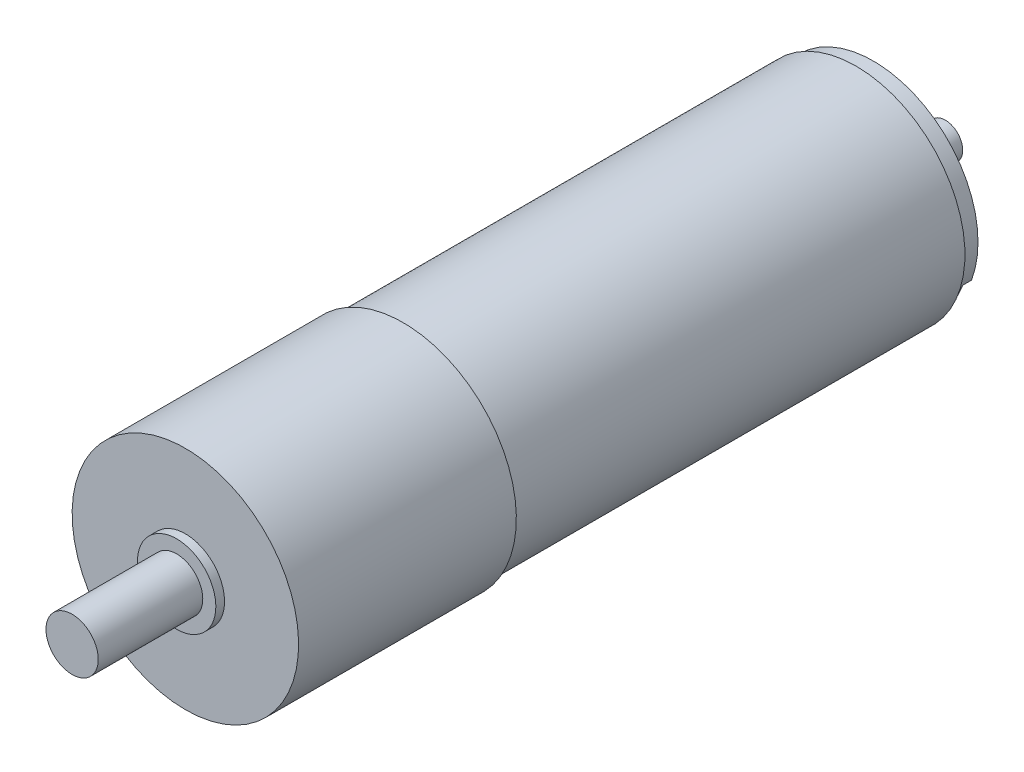
ISO-10303-21;
HEADER;
FILE_DESCRIPTION(('STEP AP214'),'2;1');
FILE_NAME('part.step','',(''),(''),'','','');
FILE_SCHEMA(('AUTOMOTIVE_DESIGN { 1 0 10303 214 1 1 1 1 }'));
ENDSEC;
DATA;
#1=APPLICATION_CONTEXT('core data for automotive mechanical design processes');
#2=APPLICATION_PROTOCOL_DEFINITION('international standard','automotive_design',2000,#1);
#3=PRODUCT_CONTEXT('',#1,'mechanical');
#4=PRODUCT('Part','Part','',(#3));
#5=PRODUCT_RELATED_PRODUCT_CATEGORY('part','',(#4));
#6=PRODUCT_DEFINITION_FORMATION('','',#4);
#7=PRODUCT_DEFINITION_CONTEXT('part definition',#1,'design');
#8=PRODUCT_DEFINITION('design','',#6,#7);
#9=PRODUCT_DEFINITION_SHAPE('','',#8);
#10=(LENGTH_UNIT() NAMED_UNIT(*) SI_UNIT(.MILLI.,.METRE.));
#11=(NAMED_UNIT(*) PLANE_ANGLE_UNIT() SI_UNIT($,.RADIAN.));
#12=(NAMED_UNIT(*) SI_UNIT($,.STERADIAN.) SOLID_ANGLE_UNIT());
#13=UNCERTAINTY_MEASURE_WITH_UNIT(LENGTH_MEASURE(1.E-05),#10,'distance_accuracy_value','');
#14=(GEOMETRIC_REPRESENTATION_CONTEXT(3) GLOBAL_UNCERTAINTY_ASSIGNED_CONTEXT((#13)) GLOBAL_UNIT_ASSIGNED_CONTEXT((#10,
#11,#12)) REPRESENTATION_CONTEXT('',''));
#15=CARTESIAN_POINT('',(0.,0.,0.));
#16=DIRECTION('',(0.,0.,1.));
#17=DIRECTION('',(1.,0.,0.));
#18=AXIS2_PLACEMENT_3D('',#15,#16,#17);
#19=CARTESIAN_POINT('',(0.,0.,76.));
#20=DIRECTION('',(0.,0.,-1.));
#21=DIRECTION('',(0.,1.,0.));
#22=AXIS2_PLACEMENT_3D('',#19,#20,#21);
#23=PLANE('',#22);
#24=CARTESIAN_POINT('',(0.,0.,76.));
#25=DIRECTION('',(0.,0.,1.));
#26=DIRECTION('',(0.,-1.,0.));
#27=AXIS2_PLACEMENT_3D('',#24,#25,#26);
#28=CIRCLE('',#27,6.00000000000001);
#29=CARTESIAN_POINT('',(0.,-6.00000000000002,76.));
#30=VERTEX_POINT('',#29);
#31=EDGE_CURVE('E157',#30,#30,#28,.T.);
#32=ORIENTED_EDGE('',*,*,#31,.T.);
#33=EDGE_LOOP('',(#32));
#34=FACE_BOUND('',#33,.T.);
#35=ADVANCED_FACE('F33',(#34),#23,.F.);
#36=CARTESIAN_POINT('',(0.,0.,76.));
#37=DIRECTION('',(0.,0.,1.));
#38=DIRECTION('',(0.,-1.,0.));
#39=AXIS2_PLACEMENT_3D('',#36,#37,#38);
#40=CYLINDRICAL_SURFACE('',#39,6.00000000000001);
#41=ORIENTED_EDGE('',*,*,#31,.F.);
#42=EDGE_LOOP('',(#41));
#43=FACE_BOUND('',#42,.T.);
#44=CARTESIAN_POINT('',(0.,0.,52.));
#45=DIRECTION('',(0.,0.,1.));
#46=DIRECTION('',(0.,-1.,0.));
#47=AXIS2_PLACEMENT_3D('',#44,#45,#46);
#48=CIRCLE('',#47,6.00000000000001);
#49=CARTESIAN_POINT('',(0.,-6.00000000000002,52.));
#50=VERTEX_POINT('',#49);
#51=EDGE_CURVE('E154',#50,#50,#48,.T.);
#52=ORIENTED_EDGE('',*,*,#51,.T.);
#53=EDGE_LOOP('',(#52));
#54=FACE_BOUND('',#53,.T.);
#55=ADVANCED_FACE('F183',(#43,#54),#40,.T.);
#56=CARTESIAN_POINT('',(0.,6.,52.));
#57=DIRECTION('',(0.,0.,-1.));
#58=DIRECTION('',(0.,1.,0.));
#59=AXIS2_PLACEMENT_3D('',#56,#57,#58);
#60=PLANE('',#59);
#61=ORIENTED_EDGE('',*,*,#51,.F.);
#62=EDGE_LOOP('',(#61));
#63=FACE_BOUND('',#62,.T.);
#64=CARTESIAN_POINT('',(0.,0.,52.));
#65=DIRECTION('',(0.,0.,1.));
#66=DIRECTION('',(0.,-1.,0.));
#67=AXIS2_PLACEMENT_3D('',#64,#65,#66);
#68=CIRCLE('',#67,9.00000000000001);
#69=CARTESIAN_POINT('',(0.,-9.00000000000002,52.));
#70=VERTEX_POINT('',#69);
#71=EDGE_CURVE('E151',#70,#70,#68,.T.);
#72=ORIENTED_EDGE('',*,*,#71,.T.);
#73=EDGE_LOOP('',(#72));
#74=FACE_BOUND('',#73,.T.);
#75=ADVANCED_FACE('F188',(#63,#74),#60,.F.);
#76=CARTESIAN_POINT('',(0.,0.,76.));
#77=DIRECTION('',(0.,0.,1.));
#78=DIRECTION('',(0.,-1.,0.));
#79=AXIS2_PLACEMENT_3D('',#76,#77,#78);
#80=CYLINDRICAL_SURFACE('',#79,9.00000000000001);
#81=ORIENTED_EDGE('',*,*,#71,.F.);
#82=EDGE_LOOP('',(#81));
#83=FACE_BOUND('',#82,.T.);
#84=CARTESIAN_POINT('',(0.,0.,50.));
#85=DIRECTION('',(0.,0.,1.));
#86=DIRECTION('',(0.,-1.,0.));
#87=AXIS2_PLACEMENT_3D('',#84,#85,#86);
#88=CIRCLE('',#87,9.00000000000001);
#89=CARTESIAN_POINT('',(0.,-9.00000000000002,50.));
#90=VERTEX_POINT('',#89);
#91=EDGE_CURVE('E148',#90,#90,#88,.T.);
#92=ORIENTED_EDGE('',*,*,#91,.T.);
#93=EDGE_LOOP('',(#92));
#94=FACE_BOUND('',#93,.T.);
#95=ADVANCED_FACE('F196',(#83,#94),#80,.T.);
#96=CARTESIAN_POINT('',(0.,9.,50.));
#97=DIRECTION('',(0.,0.,-1.));
#98=DIRECTION('',(0.,1.,0.));
#99=AXIS2_PLACEMENT_3D('',#96,#97,#98);
#100=PLANE('',#99);
#101=ORIENTED_EDGE('',*,*,#91,.F.);
#102=EDGE_LOOP('',(#101));
#103=FACE_BOUND('',#102,.T.);
#104=CARTESIAN_POINT('',(0.,0.,50.));
#105=DIRECTION('',(0.,0.,1.));
#106=DIRECTION('',(0.,-1.,0.));
#107=AXIS2_PLACEMENT_3D('',#104,#105,#106);
#108=CIRCLE('',#107,26.);
#109=CARTESIAN_POINT('',(0.,-26.,50.));
#110=VERTEX_POINT('',#109);
#111=EDGE_CURVE('E145',#110,#110,#108,.T.);
#112=ORIENTED_EDGE('',*,*,#111,.T.);
#113=EDGE_LOOP('',(#112));
#114=FACE_BOUND('',#113,.T.);
#115=ADVANCED_FACE('F202',(#103,#114),#100,.F.);
#116=CARTESIAN_POINT('',(0.,0.,76.));
#117=DIRECTION('',(0.,0.,1.));
#118=DIRECTION('',(0.,-1.,0.));
#119=AXIS2_PLACEMENT_3D('',#116,#117,#118);
#120=CYLINDRICAL_SURFACE('',#119,26.);
#121=ORIENTED_EDGE('',*,*,#111,.F.);
#122=EDGE_LOOP('',(#121));
#123=FACE_BOUND('',#122,.T.);
#124=CARTESIAN_POINT('',(0.,0.,0.));
#125=DIRECTION('',(0.,0.,1.));
#126=DIRECTION('',(0.,-1.,0.));
#127=AXIS2_PLACEMENT_3D('',#124,#125,#126);
#128=CIRCLE('',#127,26.);
#129=CARTESIAN_POINT('',(0.,-26.,0.));
#130=VERTEX_POINT('',#129);
#131=EDGE_CURVE('E142',#130,#130,#128,.T.);
#132=ORIENTED_EDGE('',*,*,#131,.T.);
#133=EDGE_LOOP('',(#132));
#134=FACE_BOUND('',#133,.T.);
#135=ADVANCED_FACE('F208',(#123,#134),#120,.T.);
#136=CARTESIAN_POINT('',(0.,26.,0.));
#137=DIRECTION('',(0.,0.,1.));
#138=DIRECTION('',(0.,-1.,0.));
#139=AXIS2_PLACEMENT_3D('',#136,#137,#138);
#140=PLANE('',#139);
#141=ORIENTED_EDGE('',*,*,#131,.F.);
#142=EDGE_LOOP('',(#141));
#143=FACE_BOUND('',#142,.T.);
#144=CARTESIAN_POINT('',(0.,0.,0.));
#145=DIRECTION('',(0.,0.,1.));
#146=DIRECTION('',(0.,-1.,0.));
#147=AXIS2_PLACEMENT_3D('',#144,#145,#146);
#148=CIRCLE('',#147,25.);
#149=CARTESIAN_POINT('',(0.,-25.,0.));
#150=VERTEX_POINT('',#149);
#151=EDGE_CURVE('E139',#150,#150,#148,.T.);
#152=ORIENTED_EDGE('',*,*,#151,.T.);
#153=EDGE_LOOP('',(#152));
#154=FACE_BOUND('',#153,.T.);
#155=ADVANCED_FACE('F214',(#143,#154),#140,.F.);
#156=CARTESIAN_POINT('',(0.,0.,76.));
#157=DIRECTION('',(0.,0.,1.));
#158=DIRECTION('',(0.,-1.,0.));
#159=AXIS2_PLACEMENT_3D('',#156,#157,#158);
#160=CYLINDRICAL_SURFACE('',#159,25.);
#161=ORIENTED_EDGE('',*,*,#151,.F.);
#162=EDGE_LOOP('',(#161));
#163=FACE_BOUND('',#162,.T.);
#164=CARTESIAN_POINT('',(0.,0.,-104.));
#165=DIRECTION('',(0.,0.,1.));
#166=DIRECTION('',(0.,-1.,0.));
#167=AXIS2_PLACEMENT_3D('',#164,#165,#166);
#168=CIRCLE('',#167,25.);
#169=CARTESIAN_POINT('',(0.,-25.,-104.));
#170=VERTEX_POINT('',#169);
#171=EDGE_CURVE('E136',#170,#170,#168,.T.);
#172=ORIENTED_EDGE('',*,*,#171,.T.);
#173=EDGE_LOOP('',(#172));
#174=FACE_BOUND('',#173,.T.);
#175=ADVANCED_FACE('F178',(#163,#174),#160,.T.);
#176=CARTESIAN_POINT('',(0.,25.,-104.));
#177=DIRECTION('',(0.,0.,1.));
#178=DIRECTION('',(0.,-1.,0.));
#179=AXIS2_PLACEMENT_3D('',#176,#177,#178);
#180=PLANE('',#179);
#181=ORIENTED_EDGE('',*,*,#171,.F.);
#182=EDGE_LOOP('',(#181));
#183=FACE_BOUND('',#182,.T.);
#184=CARTESIAN_POINT('',(0.,0.,-104.));
#185=DIRECTION('',(0.,0.,1.));
#186=DIRECTION('',(0.,-1.,0.));
#187=AXIS2_PLACEMENT_3D('',#184,#185,#186);
#188=CIRCLE('',#187,24.);
#189=CARTESIAN_POINT('',(0.,-24.,-104.));
#190=VERTEX_POINT('',#189);
#191=EDGE_CURVE('E133',#190,#190,#188,.T.);
#192=ORIENTED_EDGE('',*,*,#191,.T.);
#193=EDGE_LOOP('',(#192));
#194=FACE_BOUND('',#193,.T.);
#195=ADVANCED_FACE('F167',(#183,#194),#180,.F.);
#196=CARTESIAN_POINT('',(0.,0.,76.));
#197=DIRECTION('',(0.,0.,1.));
#198=DIRECTION('',(0.,-1.,0.));
#199=AXIS2_PLACEMENT_3D('',#196,#197,#198);
#200=CYLINDRICAL_SURFACE('',#199,24.);
#201=ORIENTED_EDGE('',*,*,#191,.F.);
#202=EDGE_LOOP('',(#201));
#203=FACE_BOUND('',#202,.T.);
#204=CARTESIAN_POINT('',(0.,0.,-106.));
#205=DIRECTION('',(0.,0.,1.));
#206=DIRECTION('',(1.,0.,0.));
#207=AXIS2_PLACEMENT_3D('',#204,#205,#206);
#208=CIRCLE('',#207,24.);
#209=CARTESIAN_POINT('',(8.37808259667982,-22.4901696748426,-106.));
#210=VERTEX_POINT('',#209);
#211=CARTESIAN_POINT('',(22.5064418611777,-8.33427109886812,-106.));
#212=VERTEX_POINT('',#211);
#213=EDGE_CURVE('E11',#210,#212,#208,.T.);
#214=ORIENTED_EDGE('',*,*,#213,.T.);
#215=DIRECTION('',(0.,0.,1.));
#216=VECTOR('',#215,1.);
#217=CARTESIAN_POINT('',(22.5064418611777,-8.33427109886813,76.));
#218=LINE('',#217,#216);
#219=CARTESIAN_POINT('',(22.5064418611777,-8.33427109886813,-108.));
#220=VERTEX_POINT('',#219);
#221=EDGE_CURVE('E55',#212,#220,#218,.F.);
#222=ORIENTED_EDGE('',*,*,#221,.T.);
#223=CARTESIAN_POINT('',(0.,0.,-108.));
#224=DIRECTION('',(0.,0.,1.));
#225=DIRECTION('',(0.,-1.,0.));
#226=AXIS2_PLACEMENT_3D('',#223,#224,#225);
#227=CIRCLE('',#226,24.);
#228=CARTESIAN_POINT('',(8.37808259667982,-22.4901696748426,-108.));
#229=VERTEX_POINT('',#228);
#230=EDGE_CURVE('E130',#220,#229,#227,.T.);
#231=ORIENTED_EDGE('',*,*,#230,.T.);
#232=DIRECTION('',(0.,0.,1.));
#233=VECTOR('',#232,1.);
#234=CARTESIAN_POINT('',(8.37808259667982,-22.4901696748426,76.));
#235=LINE('',#234,#233);
#236=EDGE_CURVE('E47',#229,#210,#235,.T.);
#237=ORIENTED_EDGE('',*,*,#236,.T.);
#238=EDGE_LOOP('',(#214,#222,#231,#237));
#239=FACE_BOUND('',#238,.T.);
#240=ADVANCED_FACE('F165',(#203,#239),#200,.T.);
#241=CARTESIAN_POINT('',(0.,24.,-108.));
#242=DIRECTION('',(0.,0.,1.));
#243=DIRECTION('',(0.,-1.,0.));
#244=AXIS2_PLACEMENT_3D('',#241,#242,#243);
#245=PLANE('',#244);
#246=CARTESIAN_POINT('',(6.76785942282004,19.0325005932732,-108.));
#247=DIRECTION('',(0.,0.,1.));
#248=DIRECTION('',(1.,0.,0.));
#249=AXIS2_PLACEMENT_3D('',#246,#247,#248);
#250=CIRCLE('',#249,2.80000000000006);
#251=CARTESIAN_POINT('',(3.96785942281998,19.0325005932732,-108.));
#252=VERTEX_POINT('',#251);
#253=EDGE_CURVE('E105',#252,#252,#250,.T.);
#254=ORIENTED_EDGE('',*,*,#253,.T.);
#255=EDGE_LOOP('',(#254));
#256=FACE_BOUND('',#255,.T.);
#257=CARTESIAN_POINT('',(-19.9059854313234,3.43391089108909,-108.));
#258=DIRECTION('',(0.,0.,1.));
#259=DIRECTION('',(1.,0.,0.));
#260=AXIS2_PLACEMENT_3D('',#257,#258,#259);
#261=CIRCLE('',#260,2.80000000000001);
#262=CARTESIAN_POINT('',(-22.7059854313234,3.43391089108909,-108.));
#263=VERTEX_POINT('',#262);
#264=EDGE_CURVE('E111',#263,#263,#261,.T.);
#265=ORIENTED_EDGE('',*,*,#264,.T.);
#266=EDGE_LOOP('',(#265));
#267=FACE_BOUND('',#266,.T.);
#268=CARTESIAN_POINT('',(0.,-20.2,-108.));
#269=DIRECTION('',(0.,0.,1.));
#270=DIRECTION('',(1.,0.,0.));
#271=AXIS2_PLACEMENT_3D('',#268,#269,#270);
#272=CIRCLE('',#271,2.8);
#273=CARTESIAN_POINT('',(-2.8,-20.2,-108.));
#274=VERTEX_POINT('',#273);
#275=EDGE_CURVE('E100',#274,#274,#272,.T.);
#276=ORIENTED_EDGE('',*,*,#275,.T.);
#277=EDGE_LOOP('',(#276));
#278=FACE_BOUND('',#277,.T.);
#279=ORIENTED_EDGE('',*,*,#230,.F.);
#280=DIRECTION('',(0.707794928798725,-0.706417963224895,0.));
#281=VECTOR('',#280,1.);
#282=CARTESIAN_POINT('',(22.5064418611777,-8.33427109886812,-108.));
#283=LINE('',#282,#281);
#284=CARTESIAN_POINT('',(16.9733086354311,-2.81190219716126,-108.));
#285=VERTEX_POINT('',#284);
#286=EDGE_CURVE('E95',#285,#220,#283,.T.);
#287=ORIENTED_EDGE('',*,*,#286,.F.);
#288=DIRECTION('',(0.706417963224894,0.707794928798725,0.));
#289=VECTOR('',#288,1.);
#290=CARTESIAN_POINT('',(16.9733086354311,-2.81190219716126,-108.));
#291=LINE('',#290,#289);
#292=CARTESIAN_POINT('',(2.84494937093321,-16.9678007731358,-108.));
#293=VERTEX_POINT('',#292);
#294=EDGE_CURVE('E93',#293,#285,#291,.T.);
#295=ORIENTED_EDGE('',*,*,#294,.F.);
#296=DIRECTION('',(0.707794928798726,-0.706417963224893,0.));
#297=VECTOR('',#296,1.);
#298=CARTESIAN_POINT('',(-19.0641568798386,4.8986828424161,-108.));
#299=LINE('',#298,#297);
#300=EDGE_CURVE('E40',#293,#229,#299,.T.);
#301=ORIENTED_EDGE('',*,*,#300,.T.);
#302=EDGE_LOOP('',(#279,#287,#295,#301));
#303=FACE_BOUND('',#302,.T.);
#304=CARTESIAN_POINT('',(0.,0.,-108.));
#305=DIRECTION('',(0.,0.,1.));
#306=DIRECTION('',(0.,-1.,0.));
#307=AXIS2_PLACEMENT_3D('',#304,#305,#306);
#308=CIRCLE('',#307,8.);
#309=CARTESIAN_POINT('',(0.,-8.,-108.));
#310=VERTEX_POINT('',#309);
#311=EDGE_CURVE('E127',#310,#310,#308,.T.);
#312=ORIENTED_EDGE('',*,*,#311,.T.);
#313=EDGE_LOOP('',(#312));
#314=FACE_BOUND('',#313,.T.);
#315=ADVANCED_FACE('F161',(#256,#267,#278,#303,#314),#245,.F.);
#316=CARTESIAN_POINT('',(0.,0.,76.));
#317=DIRECTION('',(0.,0.,1.));
#318=DIRECTION('',(0.,-1.,0.));
#319=AXIS2_PLACEMENT_3D('',#316,#317,#318);
#320=CYLINDRICAL_SURFACE('',#319,8.);
#321=ORIENTED_EDGE('',*,*,#311,.F.);
#322=EDGE_LOOP('',(#321));
#323=FACE_BOUND('',#322,.T.);
#324=CARTESIAN_POINT('',(0.,0.,-109.));
#325=DIRECTION('',(0.,0.,1.));
#326=DIRECTION('',(0.,-1.,0.));
#327=AXIS2_PLACEMENT_3D('',#324,#325,#326);
#328=CIRCLE('',#327,8.);
#329=CARTESIAN_POINT('',(0.,-8.,-109.));
#330=VERTEX_POINT('',#329);
#331=EDGE_CURVE('E124',#330,#330,#328,.T.);
#332=ORIENTED_EDGE('',*,*,#331,.T.);
#333=EDGE_LOOP('',(#332));
#334=FACE_BOUND('',#333,.T.);
#335=ADVANCED_FACE('F174',(#323,#334),#320,.T.);
#336=CARTESIAN_POINT('',(0.,8.,-109.));
#337=DIRECTION('',(0.,0.,1.));
#338=DIRECTION('',(0.,-1.,0.));
#339=AXIS2_PLACEMENT_3D('',#336,#337,#338);
#340=PLANE('',#339);
#341=ORIENTED_EDGE('',*,*,#331,.F.);
#342=EDGE_LOOP('',(#341));
#343=FACE_BOUND('',#342,.T.);
#344=CARTESIAN_POINT('',(0.,0.,-109.));
#345=DIRECTION('',(0.,0.,1.));
#346=DIRECTION('',(0.,-1.,0.));
#347=AXIS2_PLACEMENT_3D('',#344,#345,#346);
#348=CIRCLE('',#347,4.);
#349=CARTESIAN_POINT('',(0.,-4.,-109.));
#350=VERTEX_POINT('',#349);
#351=EDGE_CURVE('E121',#350,#350,#348,.T.);
#352=ORIENTED_EDGE('',*,*,#351,.T.);
#353=EDGE_LOOP('',(#352));
#354=FACE_BOUND('',#353,.T.);
#355=ADVANCED_FACE('F254',(#343,#354),#340,.F.);
#356=CARTESIAN_POINT('',(0.,0.,76.));
#357=DIRECTION('',(0.,0.,1.));
#358=DIRECTION('',(0.,-1.,0.));
#359=AXIS2_PLACEMENT_3D('',#356,#357,#358);
#360=CYLINDRICAL_SURFACE('',#359,4.);
#361=ORIENTED_EDGE('',*,*,#351,.F.);
#362=EDGE_LOOP('',(#361));
#363=FACE_BOUND('',#362,.T.);
#364=CARTESIAN_POINT('',(0.,0.,-124.5));
#365=DIRECTION('',(0.,0.,1.));
#366=DIRECTION('',(0.,-1.,0.));
#367=AXIS2_PLACEMENT_3D('',#364,#365,#366);
#368=CIRCLE('',#367,4.);
#369=CARTESIAN_POINT('',(0.,-4.,-124.5));
#370=VERTEX_POINT('',#369);
#371=EDGE_CURVE('E104',#370,#370,#368,.T.);
#372=ORIENTED_EDGE('',*,*,#371,.T.);
#373=EDGE_LOOP('',(#372));
#374=FACE_BOUND('',#373,.T.);
#375=ADVANCED_FACE('F261',(#363,#374),#360,.T.);
#376=CARTESIAN_POINT('',(0.,4.,-124.5));
#377=DIRECTION('',(0.,0.,1.));
#378=DIRECTION('',(0.,-1.,0.));
#379=AXIS2_PLACEMENT_3D('',#376,#377,#378);
#380=PLANE('',#379);
#381=ORIENTED_EDGE('',*,*,#371,.F.);
#382=EDGE_LOOP('',(#381));
#383=FACE_BOUND('',#382,.T.);
#384=ADVANCED_FACE('F269',(#383),#380,.F.);
#385=CARTESIAN_POINT('',(0.,-20.2,-104.75));
#386=DIRECTION('',(0.,0.,-1.));
#387=DIRECTION('',(-1.,0.,0.));
#388=AXIS2_PLACEMENT_3D('',#385,#386,#387);
#389=CYLINDRICAL_SURFACE('',#388,2.8);
#390=CARTESIAN_POINT('',(0.,-20.2,-104.75));
#391=DIRECTION('',(0.,0.,1.));
#392=DIRECTION('',(1.,0.,0.));
#393=AXIS2_PLACEMENT_3D('',#390,#391,#392);
#394=CIRCLE('',#393,2.8);
#395=CARTESIAN_POINT('',(-2.8,-20.2,-104.75));
#396=VERTEX_POINT('',#395);
#397=EDGE_CURVE('E114',#396,#396,#394,.T.);
#398=CARTESIAN_POINT('',(-2.8,-20.2,-104.75));
#399=CARTESIAN_POINT('',(-2.8,-20.2,-104.783854166667));
#400=CARTESIAN_POINT('',(-2.8,-20.2,-104.817708333333));
#401=CARTESIAN_POINT('',(-2.8,-20.2,-104.885416666667));
#402=CARTESIAN_POINT('',(-2.8,-20.2,-104.919270833333));
#403=CARTESIAN_POINT('',(-2.8,-20.2,-104.986979166667));
#404=CARTESIAN_POINT('',(-2.8,-20.2,-105.020833333333));
#405=CARTESIAN_POINT('',(-2.8,-20.2,-105.088541666667));
#406=CARTESIAN_POINT('',(-2.8,-20.2,-105.122395833333));
#407=CARTESIAN_POINT('',(-2.8,-20.2,-105.190104166667));
#408=CARTESIAN_POINT('',(-2.8,-20.2,-105.223958333333));
#409=CARTESIAN_POINT('',(-2.8,-20.2,-105.291666666667));
#410=CARTESIAN_POINT('',(-2.8,-20.2,-105.325520833333));
#411=CARTESIAN_POINT('',(-2.8,-20.2,-105.393229166667));
#412=CARTESIAN_POINT('',(-2.8,-20.2,-105.427083333333));
#413=CARTESIAN_POINT('',(-2.8,-20.2,-105.494791666667));
#414=CARTESIAN_POINT('',(-2.8,-20.2,-105.528645833333));
#415=CARTESIAN_POINT('',(-2.8,-20.2,-105.596354166667));
#416=CARTESIAN_POINT('',(-2.8,-20.2,-105.630208333333));
#417=CARTESIAN_POINT('',(-2.8,-20.2,-105.697916666667));
#418=CARTESIAN_POINT('',(-2.8,-20.2,-105.731770833333));
#419=CARTESIAN_POINT('',(-2.8,-20.2,-105.799479166667));
#420=CARTESIAN_POINT('',(-2.8,-20.2,-105.833333333333));
#421=CARTESIAN_POINT('',(-2.8,-20.2,-105.901041666667));
#422=CARTESIAN_POINT('',(-2.8,-20.2,-105.934895833333));
#423=CARTESIAN_POINT('',(-2.8,-20.2,-106.002604166667));
#424=CARTESIAN_POINT('',(-2.8,-20.2,-106.036458333333));
#425=CARTESIAN_POINT('',(-2.8,-20.2,-106.104166666667));
#426=CARTESIAN_POINT('',(-2.8,-20.2,-106.138020833333));
#427=CARTESIAN_POINT('',(-2.8,-20.2,-106.205729166667));
#428=CARTESIAN_POINT('',(-2.8,-20.2,-106.239583333333));
#429=CARTESIAN_POINT('',(-2.8,-20.2,-106.307291666667));
#430=CARTESIAN_POINT('',(-2.8,-20.2,-106.341145833333));
#431=CARTESIAN_POINT('',(-2.8,-20.2,-106.408854166667));
#432=CARTESIAN_POINT('',(-2.8,-20.2,-106.442708333333));
#433=CARTESIAN_POINT('',(-2.8,-20.2,-106.510416666667));
#434=CARTESIAN_POINT('',(-2.8,-20.2,-106.544270833333));
#435=CARTESIAN_POINT('',(-2.8,-20.2,-106.611979166667));
#436=CARTESIAN_POINT('',(-2.8,-20.2,-106.645833333333));
#437=CARTESIAN_POINT('',(-2.8,-20.2,-106.713541666667));
#438=CARTESIAN_POINT('',(-2.8,-20.2,-106.747395833333));
#439=CARTESIAN_POINT('',(-2.8,-20.2,-106.815104166667));
#440=CARTESIAN_POINT('',(-2.8,-20.2,-106.848958333333));
#441=CARTESIAN_POINT('',(-2.8,-20.2,-106.916666666667));
#442=CARTESIAN_POINT('',(-2.8,-20.2,-106.950520833333));
#443=CARTESIAN_POINT('',(-2.8,-20.2,-107.018229166667));
#444=CARTESIAN_POINT('',(-2.8,-20.2,-107.052083333333));
#445=CARTESIAN_POINT('',(-2.8,-20.2,-107.119791666667));
#446=CARTESIAN_POINT('',(-2.8,-20.2,-107.153645833333));
#447=CARTESIAN_POINT('',(-2.8,-20.2,-107.221354166667));
#448=CARTESIAN_POINT('',(-2.8,-20.2,-107.255208333333));
#449=CARTESIAN_POINT('',(-2.8,-20.2,-107.322916666667));
#450=CARTESIAN_POINT('',(-2.8,-20.2,-107.356770833333));
#451=CARTESIAN_POINT('',(-2.8,-20.2,-107.424479166667));
#452=CARTESIAN_POINT('',(-2.8,-20.2,-107.458333333333));
#453=CARTESIAN_POINT('',(-2.8,-20.2,-107.526041666667));
#454=CARTESIAN_POINT('',(-2.8,-20.2,-107.559895833333));
#455=CARTESIAN_POINT('',(-2.8,-20.2,-107.627604166667));
#456=CARTESIAN_POINT('',(-2.8,-20.2,-107.661458333333));
#457=CARTESIAN_POINT('',(-2.8,-20.2,-107.729166666667));
#458=CARTESIAN_POINT('',(-2.8,-20.2,-107.763020833333));
#459=CARTESIAN_POINT('',(-2.8,-20.2,-107.830729166667));
#460=CARTESIAN_POINT('',(-2.8,-20.2,-107.864583333333));
#461=CARTESIAN_POINT('',(-2.8,-20.2,-107.932291666667));
#462=CARTESIAN_POINT('',(-2.8,-20.2,-107.966145833333));
#463=CARTESIAN_POINT('',(-2.8,-20.2,-108.));
#464=B_SPLINE_CURVE_WITH_KNOTS('',3,(#398,#399,#400,#401,#402,#403,#404,#405,#406,#407,#408,
#409,#410,#411,#412,#413,#414,#415,#416,#417,#418,#419,#420,#421,#422,#423,#424,#425,#426,#427,
#428,#429,#430,#431,#432,#433,#434,#435,#436,#437,#438,#439,#440,#441,#442,#443,#444,#445,#446,
#447,#448,#449,#450,#451,#452,#453,#454,#455,#456,#457,#458,#459,#460,#461,#462,#463),
.UNSPECIFIED.,.F.,.F.,(4,2,2,2,2,2,2,2,2,2,2,2,2,2,2,2,2,2,2,2,2,2,2,2,2,2,2,2,2,2,2,2,4),(0.,
0.101562500000013,0.203125000000012,0.304687500000012,0.406250000000011,0.50781250000001,
0.609375000000009,0.710937500000008,0.812500000000008,0.914062500000007,1.01562500000001,
1.11718750000001,1.21875,1.3203125,1.421875,1.5234375,1.62500000000002,1.72656250000001,
1.82812500000001,1.92968750000001,2.03125000000001,2.13281250000001,2.23437500000001,
2.33593750000001,2.43750000000001,2.53906250000001,2.64062500000001,2.74218750000001,
2.84375000000001,2.94531250000001,3.046875,3.1484375,3.25000000000002),.UNSPECIFIED.);
#465=EDGE_CURVE('BSEAM277',#396,#274,#464,.T.);
#466=ORIENTED_EDGE('',*,*,#397,.T.);
#467=ORIENTED_EDGE('',*,*,#275,.F.);
#468=ORIENTED_EDGE('',*,*,#465,.T.);
#469=ORIENTED_EDGE('',*,*,#465,.F.);
#470=EDGE_LOOP('',(#466,#468,#467,#469));
#471=FACE_BOUND('',#470,.T.);
#472=ADVANCED_FACE('F277',(#471),#389,.F.);
#473=CARTESIAN_POINT('',(0.,-20.2,-104.75));
#474=DIRECTION('',(0.,0.,1.));
#475=DIRECTION('',(1.,0.,0.));
#476=AXIS2_PLACEMENT_3D('',#473,#474,#475);
#477=PLANE('',#476);
#478=ORIENTED_EDGE('',*,*,#397,.F.);
#479=EDGE_LOOP('',(#478));
#480=FACE_BOUND('',#479,.T.);
#481=ADVANCED_FACE('F285',(#480),#477,.F.);
#482=CARTESIAN_POINT('',(-19.9059854313234,3.43391089108909,-104.75));
#483=DIRECTION('',(0.,0.,-1.));
#484=DIRECTION('',(-1.,0.,0.));
#485=AXIS2_PLACEMENT_3D('',#482,#483,#484);
#486=CYLINDRICAL_SURFACE('',#485,2.80000000000001);
#487=CARTESIAN_POINT('',(-19.9059854313234,3.43391089108909,-104.75));
#488=DIRECTION('',(0.,0.,1.));
#489=DIRECTION('',(1.,0.,0.));
#490=AXIS2_PLACEMENT_3D('',#487,#488,#489);
#491=CIRCLE('',#490,2.80000000000001);
#492=CARTESIAN_POINT('',(-22.7059854313234,3.43391089108909,-104.75));
#493=VERTEX_POINT('',#492);
#494=EDGE_CURVE('E108',#493,#493,#491,.T.);
#495=CARTESIAN_POINT('',(-22.7059854313234,3.43391089108909,-104.75));
#496=CARTESIAN_POINT('',(-22.7059854313234,3.43391089108909,-104.783854166667));
#497=CARTESIAN_POINT('',(-22.7059854313234,3.43391089108909,-104.817708333333));
#498=CARTESIAN_POINT('',(-22.7059854313234,3.43391089108909,-104.885416666667));
#499=CARTESIAN_POINT('',(-22.7059854313234,3.43391089108909,-104.919270833333));
#500=CARTESIAN_POINT('',(-22.7059854313234,3.43391089108909,-104.986979166667));
#501=CARTESIAN_POINT('',(-22.7059854313234,3.43391089108909,-105.020833333333));
#502=CARTESIAN_POINT('',(-22.7059854313234,3.43391089108909,-105.088541666667));
#503=CARTESIAN_POINT('',(-22.7059854313234,3.43391089108909,-105.122395833333));
#504=CARTESIAN_POINT('',(-22.7059854313234,3.43391089108909,-105.190104166667));
#505=CARTESIAN_POINT('',(-22.7059854313234,3.43391089108909,-105.223958333333));
#506=CARTESIAN_POINT('',(-22.7059854313234,3.43391089108909,-105.291666666667));
#507=CARTESIAN_POINT('',(-22.7059854313234,3.43391089108909,-105.325520833333));
#508=CARTESIAN_POINT('',(-22.7059854313234,3.43391089108909,-105.393229166667));
#509=CARTESIAN_POINT('',(-22.7059854313234,3.43391089108909,-105.427083333333));
#510=CARTESIAN_POINT('',(-22.7059854313234,3.43391089108909,-105.494791666667));
#511=CARTESIAN_POINT('',(-22.7059854313234,3.43391089108909,-105.528645833333));
#512=CARTESIAN_POINT('',(-22.7059854313234,3.43391089108909,-105.596354166667));
#513=CARTESIAN_POINT('',(-22.7059854313234,3.43391089108909,-105.630208333333));
#514=CARTESIAN_POINT('',(-22.7059854313234,3.43391089108909,-105.697916666667));
#515=CARTESIAN_POINT('',(-22.7059854313234,3.43391089108909,-105.731770833333));
#516=CARTESIAN_POINT('',(-22.7059854313234,3.43391089108909,-105.799479166667));
#517=CARTESIAN_POINT('',(-22.7059854313234,3.43391089108909,-105.833333333333));
#518=CARTESIAN_POINT('',(-22.7059854313234,3.43391089108909,-105.901041666667));
#519=CARTESIAN_POINT('',(-22.7059854313234,3.43391089108909,-105.934895833333));
#520=CARTESIAN_POINT('',(-22.7059854313234,3.43391089108909,-106.002604166667));
#521=CARTESIAN_POINT('',(-22.7059854313234,3.43391089108909,-106.036458333333));
#522=CARTESIAN_POINT('',(-22.7059854313234,3.43391089108909,-106.104166666667));
#523=CARTESIAN_POINT('',(-22.7059854313234,3.43391089108909,-106.138020833333));
#524=CARTESIAN_POINT('',(-22.7059854313234,3.43391089108909,-106.205729166667));
#525=CARTESIAN_POINT('',(-22.7059854313234,3.43391089108909,-106.239583333333));
#526=CARTESIAN_POINT('',(-22.7059854313234,3.43391089108909,-106.307291666667));
#527=CARTESIAN_POINT('',(-22.7059854313234,3.43391089108909,-106.341145833333));
#528=CARTESIAN_POINT('',(-22.7059854313234,3.43391089108909,-106.408854166667));
#529=CARTESIAN_POINT('',(-22.7059854313234,3.43391089108909,-106.442708333333));
#530=CARTESIAN_POINT('',(-22.7059854313234,3.43391089108909,-106.510416666667));
#531=CARTESIAN_POINT('',(-22.7059854313234,3.43391089108909,-106.544270833333));
#532=CARTESIAN_POINT('',(-22.7059854313234,3.43391089108909,-106.611979166667));
#533=CARTESIAN_POINT('',(-22.7059854313234,3.43391089108909,-106.645833333333));
#534=CARTESIAN_POINT('',(-22.7059854313234,3.43391089108909,-106.713541666667));
#535=CARTESIAN_POINT('',(-22.7059854313234,3.43391089108909,-106.747395833333));
#536=CARTESIAN_POINT('',(-22.7059854313234,3.43391089108909,-106.815104166667));
#537=CARTESIAN_POINT('',(-22.7059854313234,3.43391089108909,-106.848958333333));
#538=CARTESIAN_POINT('',(-22.7059854313234,3.43391089108909,-106.916666666667));
#539=CARTESIAN_POINT('',(-22.7059854313234,3.43391089108909,-106.950520833333));
#540=CARTESIAN_POINT('',(-22.7059854313234,3.43391089108909,-107.018229166667));
#541=CARTESIAN_POINT('',(-22.7059854313234,3.43391089108909,-107.052083333333));
#542=CARTESIAN_POINT('',(-22.7059854313234,3.43391089108909,-107.119791666667));
#543=CARTESIAN_POINT('',(-22.7059854313234,3.43391089108909,-107.153645833333));
#544=CARTESIAN_POINT('',(-22.7059854313234,3.43391089108909,-107.221354166667));
#545=CARTESIAN_POINT('',(-22.7059854313234,3.43391089108909,-107.255208333333));
#546=CARTESIAN_POINT('',(-22.7059854313234,3.43391089108909,-107.322916666667));
#547=CARTESIAN_POINT('',(-22.7059854313234,3.43391089108909,-107.356770833333));
#548=CARTESIAN_POINT('',(-22.7059854313234,3.43391089108909,-107.424479166667));
#549=CARTESIAN_POINT('',(-22.7059854313234,3.43391089108909,-107.458333333333));
#550=CARTESIAN_POINT('',(-22.7059854313234,3.43391089108909,-107.526041666667));
#551=CARTESIAN_POINT('',(-22.7059854313234,3.43391089108909,-107.559895833333));
#552=CARTESIAN_POINT('',(-22.7059854313234,3.43391089108909,-107.627604166667));
#553=CARTESIAN_POINT('',(-22.7059854313234,3.43391089108909,-107.661458333333));
#554=CARTESIAN_POINT('',(-22.7059854313234,3.43391089108909,-107.729166666667));
#555=CARTESIAN_POINT('',(-22.7059854313234,3.43391089108909,-107.763020833333));
#556=CARTESIAN_POINT('',(-22.7059854313234,3.43391089108909,-107.830729166667));
#557=CARTESIAN_POINT('',(-22.7059854313234,3.43391089108909,-107.864583333333));
#558=CARTESIAN_POINT('',(-22.7059854313234,3.43391089108909,-107.932291666667));
#559=CARTESIAN_POINT('',(-22.7059854313234,3.43391089108909,-107.966145833333));
#560=CARTESIAN_POINT('',(-22.7059854313234,3.43391089108909,-108.));
#561=B_SPLINE_CURVE_WITH_KNOTS('',3,(#495,#496,#497,#498,#499,#500,#501,#502,#503,#504,#505,
#506,#507,#508,#509,#510,#511,#512,#513,#514,#515,#516,#517,#518,#519,#520,#521,#522,#523,#524,
#525,#526,#527,#528,#529,#530,#531,#532,#533,#534,#535,#536,#537,#538,#539,#540,#541,#542,#543,
#544,#545,#546,#547,#548,#549,#550,#551,#552,#553,#554,#555,#556,#557,#558,#559,#560),
.UNSPECIFIED.,.F.,.F.,(4,2,2,2,2,2,2,2,2,2,2,2,2,2,2,2,2,2,2,2,2,2,2,2,2,2,2,2,2,2,2,2,4),(0.,
0.101562500000013,0.203125000000012,0.304687500000012,0.406250000000011,0.50781250000001,
0.609375000000009,0.710937500000008,0.812500000000008,0.914062500000007,1.01562500000001,
1.11718750000001,1.21875,1.3203125,1.421875,1.5234375,1.62500000000002,1.72656250000001,
1.82812500000001,1.92968750000001,2.03125000000001,2.13281250000001,2.23437500000001,
2.33593750000001,2.43750000000001,2.53906250000001,2.64062500000001,2.74218750000001,
2.84375000000001,2.94531250000001,3.046875,3.1484375,3.25000000000002),.UNSPECIFIED.);
#562=EDGE_CURVE('BSEAM293',#493,#263,#561,.T.);
#563=ORIENTED_EDGE('',*,*,#494,.T.);
#564=ORIENTED_EDGE('',*,*,#264,.F.);
#565=ORIENTED_EDGE('',*,*,#562,.T.);
#566=ORIENTED_EDGE('',*,*,#562,.F.);
#567=EDGE_LOOP('',(#563,#565,#564,#566));
#568=FACE_BOUND('',#567,.T.);
#569=ADVANCED_FACE('F293',(#568),#486,.F.);
#570=CARTESIAN_POINT('',(-19.9059854313234,3.43391089108909,-104.75));
#571=DIRECTION('',(0.,0.,1.));
#572=DIRECTION('',(1.,0.,0.));
#573=AXIS2_PLACEMENT_3D('',#570,#571,#572);
#574=PLANE('',#573);
#575=ORIENTED_EDGE('',*,*,#494,.F.);
#576=EDGE_LOOP('',(#575));
#577=FACE_BOUND('',#576,.T.);
#578=ADVANCED_FACE('F301',(#577),#574,.F.);
#579=CARTESIAN_POINT('',(6.76785942282004,19.0325005932732,-104.75));
#580=DIRECTION('',(0.,0.,-1.));
#581=DIRECTION('',(-1.,0.,0.));
#582=AXIS2_PLACEMENT_3D('',#579,#580,#581);
#583=CYLINDRICAL_SURFACE('',#582,2.80000000000006);
#584=CARTESIAN_POINT('',(6.76785942282004,19.0325005932732,-104.75));
#585=DIRECTION('',(0.,0.,1.));
#586=DIRECTION('',(1.,0.,0.));
#587=AXIS2_PLACEMENT_3D('',#584,#585,#586);
#588=CIRCLE('',#587,2.80000000000006);
#589=CARTESIAN_POINT('',(3.96785942281998,19.0325005932732,-104.75));
#590=VERTEX_POINT('',#589);
#591=EDGE_CURVE('E101',#590,#590,#588,.T.);
#592=CARTESIAN_POINT('',(3.96785942281998,19.0325005932732,-104.75));
#593=CARTESIAN_POINT('',(3.96785942281998,19.0325005932732,-104.783854166667));
#594=CARTESIAN_POINT('',(3.96785942281998,19.0325005932732,-104.817708333333));
#595=CARTESIAN_POINT('',(3.96785942281998,19.0325005932732,-104.885416666667));
#596=CARTESIAN_POINT('',(3.96785942281998,19.0325005932732,-104.919270833333));
#597=CARTESIAN_POINT('',(3.96785942281998,19.0325005932732,-104.986979166667));
#598=CARTESIAN_POINT('',(3.96785942281998,19.0325005932732,-105.020833333333));
#599=CARTESIAN_POINT('',(3.96785942281998,19.0325005932732,-105.088541666667));
#600=CARTESIAN_POINT('',(3.96785942281998,19.0325005932732,-105.122395833333));
#601=CARTESIAN_POINT('',(3.96785942281998,19.0325005932732,-105.190104166667));
#602=CARTESIAN_POINT('',(3.96785942281998,19.0325005932732,-105.223958333333));
#603=CARTESIAN_POINT('',(3.96785942281998,19.0325005932732,-105.291666666667));
#604=CARTESIAN_POINT('',(3.96785942281998,19.0325005932732,-105.325520833333));
#605=CARTESIAN_POINT('',(3.96785942281998,19.0325005932732,-105.393229166667));
#606=CARTESIAN_POINT('',(3.96785942281998,19.0325005932732,-105.427083333333));
#607=CARTESIAN_POINT('',(3.96785942281998,19.0325005932732,-105.494791666667));
#608=CARTESIAN_POINT('',(3.96785942281998,19.0325005932732,-105.528645833333));
#609=CARTESIAN_POINT('',(3.96785942281998,19.0325005932732,-105.596354166667));
#610=CARTESIAN_POINT('',(3.96785942281998,19.0325005932732,-105.630208333333));
#611=CARTESIAN_POINT('',(3.96785942281998,19.0325005932732,-105.697916666667));
#612=CARTESIAN_POINT('',(3.96785942281998,19.0325005932732,-105.731770833333));
#613=CARTESIAN_POINT('',(3.96785942281998,19.0325005932732,-105.799479166667));
#614=CARTESIAN_POINT('',(3.96785942281998,19.0325005932732,-105.833333333333));
#615=CARTESIAN_POINT('',(3.96785942281998,19.0325005932732,-105.901041666667));
#616=CARTESIAN_POINT('',(3.96785942281998,19.0325005932732,-105.934895833333));
#617=CARTESIAN_POINT('',(3.96785942281998,19.0325005932732,-106.002604166667));
#618=CARTESIAN_POINT('',(3.96785942281998,19.0325005932732,-106.036458333333));
#619=CARTESIAN_POINT('',(3.96785942281998,19.0325005932732,-106.104166666667));
#620=CARTESIAN_POINT('',(3.96785942281998,19.0325005932732,-106.138020833333));
#621=CARTESIAN_POINT('',(3.96785942281998,19.0325005932732,-106.205729166667));
#622=CARTESIAN_POINT('',(3.96785942281998,19.0325005932732,-106.239583333333));
#623=CARTESIAN_POINT('',(3.96785942281998,19.0325005932732,-106.307291666667));
#624=CARTESIAN_POINT('',(3.96785942281998,19.0325005932732,-106.341145833333));
#625=CARTESIAN_POINT('',(3.96785942281998,19.0325005932732,-106.408854166667));
#626=CARTESIAN_POINT('',(3.96785942281998,19.0325005932732,-106.442708333333));
#627=CARTESIAN_POINT('',(3.96785942281998,19.0325005932732,-106.510416666667));
#628=CARTESIAN_POINT('',(3.96785942281998,19.0325005932732,-106.544270833333));
#629=CARTESIAN_POINT('',(3.96785942281998,19.0325005932732,-106.611979166667));
#630=CARTESIAN_POINT('',(3.96785942281998,19.0325005932732,-106.645833333333));
#631=CARTESIAN_POINT('',(3.96785942281998,19.0325005932732,-106.713541666667));
#632=CARTESIAN_POINT('',(3.96785942281998,19.0325005932732,-106.747395833333));
#633=CARTESIAN_POINT('',(3.96785942281998,19.0325005932732,-106.815104166667));
#634=CARTESIAN_POINT('',(3.96785942281998,19.0325005932732,-106.848958333333));
#635=CARTESIAN_POINT('',(3.96785942281998,19.0325005932732,-106.916666666667));
#636=CARTESIAN_POINT('',(3.96785942281998,19.0325005932732,-106.950520833333));
#637=CARTESIAN_POINT('',(3.96785942281998,19.0325005932732,-107.018229166667));
#638=CARTESIAN_POINT('',(3.96785942281998,19.0325005932732,-107.052083333333));
#639=CARTESIAN_POINT('',(3.96785942281998,19.0325005932732,-107.119791666667));
#640=CARTESIAN_POINT('',(3.96785942281998,19.0325005932732,-107.153645833333));
#641=CARTESIAN_POINT('',(3.96785942281998,19.0325005932732,-107.221354166667));
#642=CARTESIAN_POINT('',(3.96785942281998,19.0325005932732,-107.255208333333));
#643=CARTESIAN_POINT('',(3.96785942281998,19.0325005932732,-107.322916666667));
#644=CARTESIAN_POINT('',(3.96785942281998,19.0325005932732,-107.356770833333));
#645=CARTESIAN_POINT('',(3.96785942281998,19.0325005932732,-107.424479166667));
#646=CARTESIAN_POINT('',(3.96785942281998,19.0325005932732,-107.458333333333));
#647=CARTESIAN_POINT('',(3.96785942281998,19.0325005932732,-107.526041666667));
#648=CARTESIAN_POINT('',(3.96785942281998,19.0325005932732,-107.559895833333));
#649=CARTESIAN_POINT('',(3.96785942281998,19.0325005932732,-107.627604166667));
#650=CARTESIAN_POINT('',(3.96785942281998,19.0325005932732,-107.661458333333));
#651=CARTESIAN_POINT('',(3.96785942281998,19.0325005932732,-107.729166666667));
#652=CARTESIAN_POINT('',(3.96785942281998,19.0325005932732,-107.763020833333));
#653=CARTESIAN_POINT('',(3.96785942281998,19.0325005932732,-107.830729166667));
#654=CARTESIAN_POINT('',(3.96785942281998,19.0325005932732,-107.864583333333));
#655=CARTESIAN_POINT('',(3.96785942281998,19.0325005932732,-107.932291666667));
#656=CARTESIAN_POINT('',(3.96785942281998,19.0325005932732,-107.966145833333));
#657=CARTESIAN_POINT('',(3.96785942281998,19.0325005932732,-108.));
#658=B_SPLINE_CURVE_WITH_KNOTS('',3,(#592,#593,#594,#595,#596,#597,#598,#599,#600,#601,#602,
#603,#604,#605,#606,#607,#608,#609,#610,#611,#612,#613,#614,#615,#616,#617,#618,#619,#620,#621,
#622,#623,#624,#625,#626,#627,#628,#629,#630,#631,#632,#633,#634,#635,#636,#637,#638,#639,#640,
#641,#642,#643,#644,#645,#646,#647,#648,#649,#650,#651,#652,#653,#654,#655,#656,#657),
.UNSPECIFIED.,.F.,.F.,(4,2,2,2,2,2,2,2,2,2,2,2,2,2,2,2,2,2,2,2,2,2,2,2,2,2,2,2,2,2,2,2,4),(0.,
0.101562500000013,0.203125000000012,0.304687500000012,0.406250000000011,0.50781250000001,
0.609375000000009,0.710937500000008,0.812500000000008,0.914062500000007,1.01562500000001,
1.11718750000001,1.21875,1.3203125,1.421875,1.5234375,1.62500000000002,1.72656250000001,
1.82812500000001,1.92968750000001,2.03125000000001,2.13281250000001,2.23437500000001,
2.33593750000001,2.43750000000001,2.53906250000001,2.64062500000001,2.74218750000001,
2.84375000000001,2.94531250000001,3.046875,3.1484375,3.25000000000002),.UNSPECIFIED.);
#659=EDGE_CURVE('BSEAM309',#590,#252,#658,.T.);
#660=ORIENTED_EDGE('',*,*,#591,.T.);
#661=ORIENTED_EDGE('',*,*,#253,.F.);
#662=ORIENTED_EDGE('',*,*,#659,.T.);
#663=ORIENTED_EDGE('',*,*,#659,.F.);
#664=EDGE_LOOP('',(#660,#662,#661,#663));
#665=FACE_BOUND('',#664,.T.);
#666=ADVANCED_FACE('F309',(#665),#583,.F.);
#667=CARTESIAN_POINT('',(6.76785942282004,19.0325005932732,-104.75));
#668=DIRECTION('',(0.,0.,1.));
#669=DIRECTION('',(1.,0.,0.));
#670=AXIS2_PLACEMENT_3D('',#667,#668,#669);
#671=PLANE('',#670);
#672=ORIENTED_EDGE('',*,*,#591,.F.);
#673=EDGE_LOOP('',(#672));
#674=FACE_BOUND('',#673,.T.);
#675=ADVANCED_FACE('F317',(#674),#671,.F.);
#676=CARTESIAN_POINT('',(0.,0.,-106.));
#677=DIRECTION('',(0.,0.,1.));
#678=DIRECTION('',(1.,0.,0.));
#679=AXIS2_PLACEMENT_3D('',#676,#677,#678);
#680=PLANE('',#679);
#681=DIRECTION('',(-0.707794928798726,0.706417963224894,0.));
#682=VECTOR('',#681,1.);
#683=CARTESIAN_POINT('',(8.37808259667981,-22.4901696748426,-106.));
#684=LINE('',#683,#682);
#685=CARTESIAN_POINT('',(2.84494937093321,-16.9678007731358,-106.));
#686=VERTEX_POINT('',#685);
#687=EDGE_CURVE('E73',#210,#686,#684,.T.);
#688=ORIENTED_EDGE('',*,*,#687,.T.);
#689=DIRECTION('',(0.706417963224894,0.707794928798725,0.));
#690=VECTOR('',#689,1.);
#691=CARTESIAN_POINT('',(16.9733086354311,-2.81190219716126,-106.));
#692=LINE('',#691,#690);
#693=CARTESIAN_POINT('',(16.9733086354311,-2.81190219716126,-106.));
#694=VERTEX_POINT('',#693);
#695=EDGE_CURVE('E77',#686,#694,#692,.T.);
#696=ORIENTED_EDGE('',*,*,#695,.T.);
#697=DIRECTION('',(0.707794928798725,-0.706417963224895,0.));
#698=VECTOR('',#697,1.);
#699=CARTESIAN_POINT('',(25.4668477810158,-11.28891775586,-106.));
#700=LINE('',#699,#698);
#701=EDGE_CURVE('E78',#694,#212,#700,.T.);
#702=ORIENTED_EDGE('',*,*,#701,.T.);
#703=ORIENTED_EDGE('',*,*,#213,.F.);
#704=EDGE_LOOP('',(#688,#696,#702,#703));
#705=FACE_BOUND('',#704,.T.);
#706=ADVANCED_FACE('F75',(#705),#680,.F.);
#707=CARTESIAN_POINT('',(22.5064418611777,-8.33427109886812,-106.));
#708=DIRECTION('',(0.706417963224895,0.707794928798725,0.));
#709=DIRECTION('',(-0.707794928798725,0.706417963224895,0.));
#710=AXIS2_PLACEMENT_3D('',#707,#708,#709);
#711=PLANE('',#710);
#712=ORIENTED_EDGE('',*,*,#701,.F.);
#713=DIRECTION('',(0.,0.,-1.));
#714=VECTOR('',#713,1.);
#715=CARTESIAN_POINT('',(16.9733086354311,-2.81190219716126,-106.));
#716=LINE('',#715,#714);
#717=EDGE_CURVE('E86',#694,#285,#716,.T.);
#718=ORIENTED_EDGE('',*,*,#717,.T.);
#719=ORIENTED_EDGE('',*,*,#286,.T.);
#720=ORIENTED_EDGE('',*,*,#221,.F.);
#721=EDGE_LOOP('',(#712,#718,#719,#720));
#722=FACE_BOUND('',#721,.T.);
#723=ADVANCED_FACE('F330',(#722),#711,.F.);
#724=CARTESIAN_POINT('',(2.84494937093321,-16.9678007731358,-106.));
#725=DIRECTION('',(-0.706417963224893,-0.707794928798726,0.));
#726=DIRECTION('',(0.707794928798726,-0.706417963224893,0.));
#727=AXIS2_PLACEMENT_3D('',#724,#725,#726);
#728=PLANE('',#727);
#729=ORIENTED_EDGE('',*,*,#300,.F.);
#730=DIRECTION('',(0.,0.,-1.));
#731=VECTOR('',#730,1.);
#732=CARTESIAN_POINT('',(2.84494937093321,-16.9678007731358,-106.));
#733=LINE('',#732,#731);
#734=EDGE_CURVE('E81',#686,#293,#733,.T.);
#735=ORIENTED_EDGE('',*,*,#734,.F.);
#736=ORIENTED_EDGE('',*,*,#687,.F.);
#737=ORIENTED_EDGE('',*,*,#236,.F.);
#738=EDGE_LOOP('',(#729,#735,#736,#737));
#739=FACE_BOUND('',#738,.T.);
#740=ADVANCED_FACE('F82',(#739),#728,.F.);
#741=CARTESIAN_POINT('',(16.9733086354311,-2.81190219716126,-106.));
#742=DIRECTION('',(-0.707794928798725,0.706417963224894,0.));
#743=DIRECTION('',(-0.706417963224894,-0.707794928798725,0.));
#744=AXIS2_PLACEMENT_3D('',#741,#742,#743);
#745=PLANE('',#744);
#746=ORIENTED_EDGE('',*,*,#294,.T.);
#747=ORIENTED_EDGE('',*,*,#717,.F.);
#748=ORIENTED_EDGE('',*,*,#695,.F.);
#749=ORIENTED_EDGE('',*,*,#734,.T.);
#750=EDGE_LOOP('',(#746,#747,#748,#749));
#751=FACE_BOUND('',#750,.T.);
#752=ADVANCED_FACE('F89',(#751),#745,.F.);
#753=CLOSED_SHELL('',(#35,#55,#75,#95,#115,#135,#155,#175,#195,#240,#315,#335,#355,#375,#384,
#472,#481,#569,#578,#666,#675,#706,#723,#740,#752));
#754=MANIFOLD_SOLID_BREP('B2',#753);
#755=ADVANCED_BREP_SHAPE_REPRESENTATION('',(#18,#754),#14);
#756=SHAPE_DEFINITION_REPRESENTATION(#9,#755);
ENDSEC;
END-ISO-10303-21;
